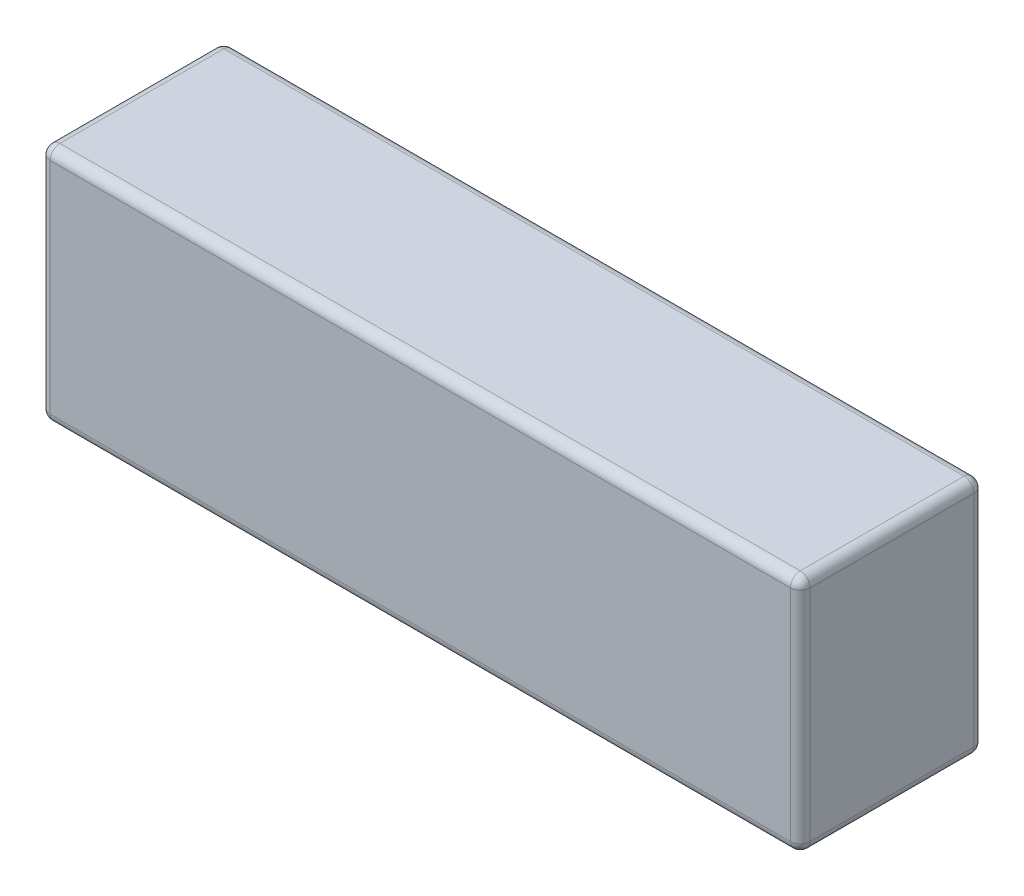
ISO-10303-21;
HEADER;
FILE_DESCRIPTION(('STEP AP214'),'2;1');
FILE_NAME('part.step','',(''),(''),'','','');
FILE_SCHEMA(('AUTOMOTIVE_DESIGN { 1 0 10303 214 1 1 1 1 }'));
ENDSEC;
DATA;
#1=APPLICATION_CONTEXT('core data for automotive mechanical design processes');
#2=APPLICATION_PROTOCOL_DEFINITION('international standard','automotive_design',2000,#1);
#3=PRODUCT_CONTEXT('',#1,'mechanical');
#4=PRODUCT('Part','Part','',(#3));
#5=PRODUCT_RELATED_PRODUCT_CATEGORY('part','',(#4));
#6=PRODUCT_DEFINITION_FORMATION('','',#4);
#7=PRODUCT_DEFINITION_CONTEXT('part definition',#1,'design');
#8=PRODUCT_DEFINITION('design','',#6,#7);
#9=PRODUCT_DEFINITION_SHAPE('','',#8);
#10=(LENGTH_UNIT() NAMED_UNIT(*) SI_UNIT(.MILLI.,.METRE.));
#11=(NAMED_UNIT(*) PLANE_ANGLE_UNIT() SI_UNIT($,.RADIAN.));
#12=(NAMED_UNIT(*) SI_UNIT($,.STERADIAN.) SOLID_ANGLE_UNIT());
#13=UNCERTAINTY_MEASURE_WITH_UNIT(LENGTH_MEASURE(1.E-05),#10,'distance_accuracy_value','');
#14=(GEOMETRIC_REPRESENTATION_CONTEXT(3) GLOBAL_UNCERTAINTY_ASSIGNED_CONTEXT((#13)) GLOBAL_UNIT_ASSIGNED_CONTEXT((#10,
#11,#12)) REPRESENTATION_CONTEXT('',''));
#15=CARTESIAN_POINT('',(0.,0.,0.));
#16=DIRECTION('',(0.,0.,1.));
#17=DIRECTION('',(1.,0.,0.));
#18=AXIS2_PLACEMENT_3D('',#15,#16,#17);
#19=CARTESIAN_POINT('',(-77.,48.5,18.6));
#20=DIRECTION('',(1.,0.,0.));
#21=DIRECTION('',(0.,0.,-1.));
#22=AXIS2_PLACEMENT_3D('',#19,#20,#21);
#23=PLANE('',#22);
#24=DIRECTION('',(0.,-1.,0.));
#25=VECTOR('',#24,1.);
#26=CARTESIAN_POINT('',(-77.,48.5,-16.6));
#27=LINE('',#26,#25);
#28=CARTESIAN_POINT('',(-77.,46.5,-16.6));
#29=VERTEX_POINT('',#28);
#30=CARTESIAN_POINT('',(-77.,2.,-16.6));
#31=VERTEX_POINT('',#30);
#32=EDGE_CURVE('E196',#29,#31,#27,.T.);
#33=ORIENTED_EDGE('',*,*,#32,.T.);
#34=DIRECTION('',(0.,0.,1.));
#35=VECTOR('',#34,1.);
#36=CARTESIAN_POINT('',(-77.,2.,18.6));
#37=LINE('',#36,#35);
#38=CARTESIAN_POINT('',(-77.,2.,16.6));
#39=VERTEX_POINT('',#38);
#40=EDGE_CURVE('E199',#31,#39,#37,.T.);
#41=ORIENTED_EDGE('',*,*,#40,.T.);
#42=DIRECTION('',(0.,-1.,0.));
#43=VECTOR('',#42,1.);
#44=CARTESIAN_POINT('',(-77.,48.5,16.6));
#45=LINE('',#44,#43);
#46=CARTESIAN_POINT('',(-77.,46.5,16.6));
#47=VERTEX_POINT('',#46);
#48=EDGE_CURVE('E190',#39,#47,#45,.F.);
#49=ORIENTED_EDGE('',*,*,#48,.T.);
#50=DIRECTION('',(0.,0.,1.));
#51=VECTOR('',#50,1.);
#52=CARTESIAN_POINT('',(-77.,46.5,-18.6));
#53=LINE('',#52,#51);
#54=EDGE_CURVE('E193',#47,#29,#53,.F.);
#55=ORIENTED_EDGE('',*,*,#54,.T.);
#56=EDGE_LOOP('',(#33,#41,#49,#55));
#57=FACE_BOUND('',#56,.T.);
#58=ADVANCED_FACE('F39',(#57),#23,.F.);
#59=CARTESIAN_POINT('',(77.,48.5,18.6));
#60=DIRECTION('',(0.,0.,-1.));
#61=DIRECTION('',(-1.,0.,0.));
#62=AXIS2_PLACEMENT_3D('',#59,#60,#61);
#63=PLANE('',#62);
#64=DIRECTION('',(1.,0.,0.));
#65=VECTOR('',#64,1.);
#66=CARTESIAN_POINT('',(-77.,46.5,18.6));
#67=LINE('',#66,#65);
#68=CARTESIAN_POINT('',(75.,46.5,18.6));
#69=VERTEX_POINT('',#68);
#70=CARTESIAN_POINT('',(-75.,46.5,18.6));
#71=VERTEX_POINT('',#70);
#72=EDGE_CURVE('E49',#69,#71,#67,.F.);
#73=ORIENTED_EDGE('',*,*,#72,.T.);
#74=DIRECTION('',(0.,-1.,0.));
#75=VECTOR('',#74,1.);
#76=CARTESIAN_POINT('',(-75.,48.5,18.6));
#77=LINE('',#76,#75);
#78=CARTESIAN_POINT('',(-75.,2.,18.6));
#79=VERTEX_POINT('',#78);
#80=EDGE_CURVE('E11',#71,#79,#77,.T.);
#81=ORIENTED_EDGE('',*,*,#80,.T.);
#82=DIRECTION('',(1.,0.,0.));
#83=VECTOR('',#82,1.);
#84=CARTESIAN_POINT('',(77.,2.,18.6));
#85=LINE('',#84,#83);
#86=CARTESIAN_POINT('',(75.,2.,18.6));
#87=VERTEX_POINT('',#86);
#88=EDGE_CURVE('E228',#79,#87,#85,.T.);
#89=ORIENTED_EDGE('',*,*,#88,.T.);
#90=DIRECTION('',(0.,-1.,0.));
#91=VECTOR('',#90,1.);
#92=CARTESIAN_POINT('',(75.,48.5,18.6));
#93=LINE('',#92,#91);
#94=EDGE_CURVE('E60',#87,#69,#93,.F.);
#95=ORIENTED_EDGE('',*,*,#94,.T.);
#96=EDGE_LOOP('',(#73,#81,#89,#95));
#97=FACE_BOUND('',#96,.T.);
#98=ADVANCED_FACE('F364',(#97),#63,.F.);
#99=CARTESIAN_POINT('',(77.,48.5,18.6));
#100=DIRECTION('',(-1.,0.,0.));
#101=DIRECTION('',(0.,0.,1.));
#102=AXIS2_PLACEMENT_3D('',#99,#100,#101);
#103=PLANE('',#102);
#104=DIRECTION('',(0.,-1.,0.));
#105=VECTOR('',#104,1.);
#106=CARTESIAN_POINT('',(77.,48.5,16.6));
#107=LINE('',#106,#105);
#108=CARTESIAN_POINT('',(77.,46.5,16.6));
#109=VERTEX_POINT('',#108);
#110=CARTESIAN_POINT('',(77.,2.,16.6));
#111=VERTEX_POINT('',#110);
#112=EDGE_CURVE('E132',#109,#111,#107,.T.);
#113=ORIENTED_EDGE('',*,*,#112,.T.);
#114=DIRECTION('',(0.,0.,-1.));
#115=VECTOR('',#114,1.);
#116=CARTESIAN_POINT('',(77.,2.,18.6));
#117=LINE('',#116,#115);
#118=CARTESIAN_POINT('',(77.,2.,-16.6));
#119=VERTEX_POINT('',#118);
#120=EDGE_CURVE('E174',#111,#119,#117,.T.);
#121=ORIENTED_EDGE('',*,*,#120,.T.);
#122=DIRECTION('',(0.,-1.,0.));
#123=VECTOR('',#122,1.);
#124=CARTESIAN_POINT('',(77.,48.5,-16.6));
#125=LINE('',#124,#123);
#126=CARTESIAN_POINT('',(77.,46.5,-16.6));
#127=VERTEX_POINT('',#126);
#128=EDGE_CURVE('E135',#119,#127,#125,.F.);
#129=ORIENTED_EDGE('',*,*,#128,.T.);
#130=DIRECTION('',(0.,0.,-1.));
#131=VECTOR('',#130,1.);
#132=CARTESIAN_POINT('',(77.,46.5,18.6));
#133=LINE('',#132,#131);
#134=EDGE_CURVE('E127',#127,#109,#133,.F.);
#135=ORIENTED_EDGE('',*,*,#134,.T.);
#136=EDGE_LOOP('',(#113,#121,#129,#135));
#137=FACE_BOUND('',#136,.T.);
#138=ADVANCED_FACE('F129',(#137),#103,.F.);
#139=CARTESIAN_POINT('',(77.,48.5,-18.6));
#140=DIRECTION('',(0.,0.,1.));
#141=DIRECTION('',(1.,0.,0.));
#142=AXIS2_PLACEMENT_3D('',#139,#140,#141);
#143=PLANE('',#142);
#144=DIRECTION('',(0.,-1.,0.));
#145=VECTOR('',#144,1.);
#146=CARTESIAN_POINT('',(75.,48.5,-18.6));
#147=LINE('',#146,#145);
#148=CARTESIAN_POINT('',(75.,46.5,-18.6));
#149=VERTEX_POINT('',#148);
#150=CARTESIAN_POINT('',(75.,2.,-18.6));
#151=VERTEX_POINT('',#150);
#152=EDGE_CURVE('E209',#149,#151,#147,.T.);
#153=ORIENTED_EDGE('',*,*,#152,.T.);
#154=DIRECTION('',(-1.,0.,0.));
#155=VECTOR('',#154,1.);
#156=CARTESIAN_POINT('',(77.,2.,-18.6));
#157=LINE('',#156,#155);
#158=CARTESIAN_POINT('',(-75.,2.,-18.6));
#159=VERTEX_POINT('',#158);
#160=EDGE_CURVE('E213',#151,#159,#157,.T.);
#161=ORIENTED_EDGE('',*,*,#160,.T.);
#162=DIRECTION('',(0.,-1.,0.));
#163=VECTOR('',#162,1.);
#164=CARTESIAN_POINT('',(-75.,48.5,-18.6));
#165=LINE('',#164,#163);
#166=CARTESIAN_POINT('',(-75.,46.5,-18.6));
#167=VERTEX_POINT('',#166);
#168=EDGE_CURVE('E206',#159,#167,#165,.F.);
#169=ORIENTED_EDGE('',*,*,#168,.T.);
#170=DIRECTION('',(-1.,0.,0.));
#171=VECTOR('',#170,1.);
#172=CARTESIAN_POINT('',(77.,46.5,-18.6));
#173=LINE('',#172,#171);
#174=EDGE_CURVE('E203',#167,#149,#173,.F.);
#175=ORIENTED_EDGE('',*,*,#174,.T.);
#176=EDGE_LOOP('',(#153,#161,#169,#175));
#177=FACE_BOUND('',#176,.T.);
#178=ADVANCED_FACE('F329',(#177),#143,.F.);
#179=CARTESIAN_POINT('',(0.,48.5,0.));
#180=DIRECTION('',(0.,1.,0.));
#181=DIRECTION('',(0.,0.,1.));
#182=AXIS2_PLACEMENT_3D('',#179,#180,#181);
#183=PLANE('',#182);
#184=DIRECTION('',(0.,0.,-1.));
#185=VECTOR('',#184,1.);
#186=CARTESIAN_POINT('',(75.,48.5,-18.6));
#187=LINE('',#186,#185);
#188=CARTESIAN_POINT('',(75.,48.5,16.6));
#189=VERTEX_POINT('',#188);
#190=CARTESIAN_POINT('',(75.,48.5,-16.6));
#191=VERTEX_POINT('',#190);
#192=EDGE_CURVE('E146',#189,#191,#187,.T.);
#193=ORIENTED_EDGE('',*,*,#192,.T.);
#194=DIRECTION('',(-1.,0.,0.));
#195=VECTOR('',#194,1.);
#196=CARTESIAN_POINT('',(-77.,48.5,-16.6));
#197=LINE('',#196,#195);
#198=CARTESIAN_POINT('',(-75.,48.5,-16.6));
#199=VERTEX_POINT('',#198);
#200=EDGE_CURVE('E224',#191,#199,#197,.T.);
#201=ORIENTED_EDGE('',*,*,#200,.T.);
#202=DIRECTION('',(0.,0.,1.));
#203=VECTOR('',#202,1.);
#204=CARTESIAN_POINT('',(-75.,48.5,18.6));
#205=LINE('',#204,#203);
#206=CARTESIAN_POINT('',(-75.,48.5,16.6));
#207=VERTEX_POINT('',#206);
#208=EDGE_CURVE('E219',#199,#207,#205,.T.);
#209=ORIENTED_EDGE('',*,*,#208,.T.);
#210=DIRECTION('',(1.,0.,0.));
#211=VECTOR('',#210,1.);
#212=CARTESIAN_POINT('',(77.,48.5,16.6));
#213=LINE('',#212,#211);
#214=EDGE_CURVE('E216',#207,#189,#213,.T.);
#215=ORIENTED_EDGE('',*,*,#214,.T.);
#216=EDGE_LOOP('',(#193,#201,#209,#215));
#217=FACE_BOUND('',#216,.T.);
#218=ADVANCED_FACE('F316',(#217),#183,.T.);
#219=CARTESIAN_POINT('',(0.,0.,0.));
#220=DIRECTION('',(0.,1.,0.));
#221=DIRECTION('',(0.,0.,1.));
#222=AXIS2_PLACEMENT_3D('',#219,#220,#221);
#223=PLANE('',#222);
#224=DIRECTION('',(0.,0.,1.));
#225=VECTOR('',#224,1.);
#226=CARTESIAN_POINT('',(-75.,0.,0.));
#227=LINE('',#226,#225);
#228=CARTESIAN_POINT('',(-75.,0.,16.6));
#229=VERTEX_POINT('',#228);
#230=CARTESIAN_POINT('',(-75.,0.,-16.6));
#231=VERTEX_POINT('',#230);
#232=EDGE_CURVE('E180',#229,#231,#227,.F.);
#233=ORIENTED_EDGE('',*,*,#232,.T.);
#234=DIRECTION('',(-1.,0.,0.));
#235=VECTOR('',#234,1.);
#236=CARTESIAN_POINT('',(0.,0.,-16.6));
#237=LINE('',#236,#235);
#238=CARTESIAN_POINT('',(75.,0.,-16.6));
#239=VERTEX_POINT('',#238);
#240=EDGE_CURVE('E187',#231,#239,#237,.F.);
#241=ORIENTED_EDGE('',*,*,#240,.T.);
#242=DIRECTION('',(0.,0.,-1.));
#243=VECTOR('',#242,1.);
#244=CARTESIAN_POINT('',(75.,0.,0.));
#245=LINE('',#244,#243);
#246=CARTESIAN_POINT('',(75.,0.,16.6));
#247=VERTEX_POINT('',#246);
#248=EDGE_CURVE('E183',#239,#247,#245,.F.);
#249=ORIENTED_EDGE('',*,*,#248,.T.);
#250=DIRECTION('',(1.,0.,0.));
#251=VECTOR('',#250,1.);
#252=CARTESIAN_POINT('',(0.,0.,16.6));
#253=LINE('',#252,#251);
#254=EDGE_CURVE('E177',#247,#229,#253,.F.);
#255=ORIENTED_EDGE('',*,*,#254,.T.);
#256=EDGE_LOOP('',(#233,#241,#249,#255));
#257=FACE_BOUND('',#256,.T.);
#258=ADVANCED_FACE('F530',(#257),#223,.F.);
#259=CARTESIAN_POINT('',(-75.,46.5,0.));
#260=DIRECTION('',(0.,0.,-1.));
#261=DIRECTION('',(-1.,0.,0.));
#262=AXIS2_PLACEMENT_3D('',#259,#260,#261);
#263=CYLINDRICAL_SURFACE('',#262,2.);
#264=CARTESIAN_POINT('',(-75.,46.5,16.6));
#265=DIRECTION('',(0.,0.,1.));
#266=DIRECTION('',(1.,0.,0.));
#267=AXIS2_PLACEMENT_3D('',#264,#265,#266);
#268=CIRCLE('',#267,2.);
#269=EDGE_CURVE('E43',#207,#47,#268,.T.);
#270=ORIENTED_EDGE('',*,*,#269,.F.);
#271=ORIENTED_EDGE('',*,*,#208,.F.);
#272=CARTESIAN_POINT('',(-75.,46.5,-16.6));
#273=DIRECTION('',(0.,0.,-1.));
#274=DIRECTION('',(0.,1.,0.));
#275=AXIS2_PLACEMENT_3D('',#272,#273,#274);
#276=CIRCLE('',#275,2.);
#277=EDGE_CURVE('E170',#29,#199,#276,.T.);
#278=ORIENTED_EDGE('',*,*,#277,.F.);
#279=ORIENTED_EDGE('',*,*,#54,.F.);
#280=EDGE_LOOP('',(#270,#271,#278,#279));
#281=FACE_BOUND('',#280,.T.);
#282=ADVANCED_FACE('F41',(#281),#263,.T.);
#283=CARTESIAN_POINT('',(-75.,46.5,16.6));
#284=DIRECTION('',(-1.,0.,0.));
#285=DIRECTION('',(0.,0.,1.));
#286=AXIS2_PLACEMENT_3D('',#283,#284,#285);
#287=SPHERICAL_SURFACE('',#286,2.);
#288=CARTESIAN_POINT('',(-75.,46.5,16.6));
#289=DIRECTION('',(-1.,0.,0.));
#290=DIRECTION('',(0.,-1.,0.));
#291=AXIS2_PLACEMENT_3D('',#288,#289,#290);
#292=CIRCLE('',#291,2.);
#293=EDGE_CURVE('E294',#207,#71,#292,.F.);
#294=ORIENTED_EDGE('',*,*,#293,.F.);
#295=ORIENTED_EDGE('',*,*,#269,.T.);
#296=CARTESIAN_POINT('',(-75.,46.5,16.6));
#297=DIRECTION('',(0.,1.,0.));
#298=DIRECTION('',(0.,0.,1.));
#299=AXIS2_PLACEMENT_3D('',#296,#297,#298);
#300=CIRCLE('',#299,2.);
#301=EDGE_CURVE('E297',#71,#47,#300,.F.);
#302=ORIENTED_EDGE('',*,*,#301,.F.);
#303=EDGE_LOOP('',(#294,#295,#302));
#304=FACE_BOUND('',#303,.T.);
#305=ADVANCED_FACE('F351',(#304),#287,.T.);
#306=CARTESIAN_POINT('',(-75.,46.5,-16.6));
#307=DIRECTION('',(0.,1.,0.));
#308=DIRECTION('',(0.,0.,1.));
#309=AXIS2_PLACEMENT_3D('',#306,#307,#308);
#310=SPHERICAL_SURFACE('',#309,2.);
#311=CARTESIAN_POINT('',(-75.,46.5,-16.6));
#312=DIRECTION('',(0.,1.,0.));
#313=DIRECTION('',(0.,0.,1.));
#314=AXIS2_PLACEMENT_3D('',#311,#312,#313);
#315=CIRCLE('',#314,2.);
#316=EDGE_CURVE('E287',#29,#167,#315,.F.);
#317=ORIENTED_EDGE('',*,*,#316,.F.);
#318=ORIENTED_EDGE('',*,*,#277,.T.);
#319=CARTESIAN_POINT('',(-75.,46.5,-16.6));
#320=DIRECTION('',(-1.,0.,0.));
#321=DIRECTION('',(0.,0.,1.));
#322=AXIS2_PLACEMENT_3D('',#319,#320,#321);
#323=CIRCLE('',#322,2.);
#324=EDGE_CURVE('E291',#167,#199,#323,.F.);
#325=ORIENTED_EDGE('',*,*,#324,.F.);
#326=EDGE_LOOP('',(#317,#318,#325));
#327=FACE_BOUND('',#326,.T.);
#328=ADVANCED_FACE('F307',(#327),#310,.T.);
#329=CARTESIAN_POINT('',(-75.,48.5,16.6));
#330=DIRECTION('',(0.,-1.,0.));
#331=DIRECTION('',(0.,0.,-1.));
#332=AXIS2_PLACEMENT_3D('',#329,#330,#331);
#333=CYLINDRICAL_SURFACE('',#332,2.);
#334=ORIENTED_EDGE('',*,*,#301,.T.);
#335=ORIENTED_EDGE('',*,*,#48,.F.);
#336=CARTESIAN_POINT('',(-75.,2.,16.6));
#337=DIRECTION('',(0.,-1.,0.));
#338=DIRECTION('',(0.,0.,-1.));
#339=AXIS2_PLACEMENT_3D('',#336,#337,#338);
#340=CIRCLE('',#339,2.);
#341=EDGE_CURVE('E280',#79,#39,#340,.T.);
#342=ORIENTED_EDGE('',*,*,#341,.F.);
#343=ORIENTED_EDGE('',*,*,#80,.F.);
#344=EDGE_LOOP('',(#334,#335,#342,#343));
#345=FACE_BOUND('',#344,.T.);
#346=ADVANCED_FACE('F347',(#345),#333,.T.);
#347=CARTESIAN_POINT('',(0.,46.5,16.6));
#348=DIRECTION('',(-1.,0.,0.));
#349=DIRECTION('',(0.,0.,1.));
#350=AXIS2_PLACEMENT_3D('',#347,#348,#349);
#351=CYLINDRICAL_SURFACE('',#350,2.);
#352=ORIENTED_EDGE('',*,*,#293,.T.);
#353=ORIENTED_EDGE('',*,*,#72,.F.);
#354=CARTESIAN_POINT('',(75.,46.5,16.6));
#355=DIRECTION('',(1.,0.,0.));
#356=DIRECTION('',(0.,0.,-1.));
#357=AXIS2_PLACEMENT_3D('',#354,#355,#356);
#358=CIRCLE('',#357,2.);
#359=EDGE_CURVE('E151',#189,#69,#358,.T.);
#360=ORIENTED_EDGE('',*,*,#359,.F.);
#361=ORIENTED_EDGE('',*,*,#214,.F.);
#362=EDGE_LOOP('',(#352,#353,#360,#361));
#363=FACE_BOUND('',#362,.T.);
#364=ADVANCED_FACE('F354',(#363),#351,.T.);
#365=CARTESIAN_POINT('',(75.,46.5,0.));
#366=DIRECTION('',(0.,0.,1.));
#367=DIRECTION('',(1.,0.,0.));
#368=AXIS2_PLACEMENT_3D('',#365,#366,#367);
#369=CYLINDRICAL_SURFACE('',#368,2.);
#370=CARTESIAN_POINT('',(75.,46.5,-16.6));
#371=DIRECTION('',(0.,0.,-1.));
#372=DIRECTION('',(-1.,0.,0.));
#373=AXIS2_PLACEMENT_3D('',#370,#371,#372);
#374=CIRCLE('',#373,2.);
#375=EDGE_CURVE('E152',#191,#127,#374,.T.);
#376=ORIENTED_EDGE('',*,*,#375,.F.);
#377=ORIENTED_EDGE('',*,*,#192,.F.);
#378=CARTESIAN_POINT('',(75.,46.5,16.6));
#379=DIRECTION('',(0.,0.,1.));
#380=DIRECTION('',(1.,0.,0.));
#381=AXIS2_PLACEMENT_3D('',#378,#379,#380);
#382=CIRCLE('',#381,2.);
#383=EDGE_CURVE('E143',#109,#189,#382,.T.);
#384=ORIENTED_EDGE('',*,*,#383,.F.);
#385=ORIENTED_EDGE('',*,*,#134,.F.);
#386=EDGE_LOOP('',(#376,#377,#384,#385));
#387=FACE_BOUND('',#386,.T.);
#388=ADVANCED_FACE('F145',(#387),#369,.T.);
#389=CARTESIAN_POINT('',(0.,46.5,-16.6));
#390=DIRECTION('',(1.,0.,0.));
#391=DIRECTION('',(0.,0.,-1.));
#392=AXIS2_PLACEMENT_3D('',#389,#390,#391);
#393=CYLINDRICAL_SURFACE('',#392,2.);
#394=ORIENTED_EDGE('',*,*,#324,.T.);
#395=ORIENTED_EDGE('',*,*,#200,.F.);
#396=CARTESIAN_POINT('',(75.,46.5,-16.6));
#397=DIRECTION('',(1.,0.,0.));
#398=DIRECTION('',(0.,0.,-1.));
#399=AXIS2_PLACEMENT_3D('',#396,#397,#398);
#400=CIRCLE('',#399,2.);
#401=EDGE_CURVE('E272',#149,#191,#400,.T.);
#402=ORIENTED_EDGE('',*,*,#401,.F.);
#403=ORIENTED_EDGE('',*,*,#174,.F.);
#404=EDGE_LOOP('',(#394,#395,#402,#403));
#405=FACE_BOUND('',#404,.T.);
#406=ADVANCED_FACE('F319',(#405),#393,.T.);
#407=CARTESIAN_POINT('',(-75.,48.5,-16.6));
#408=DIRECTION('',(0.,-1.,0.));
#409=DIRECTION('',(0.,0.,-1.));
#410=AXIS2_PLACEMENT_3D('',#407,#408,#409);
#411=CYLINDRICAL_SURFACE('',#410,2.);
#412=ORIENTED_EDGE('',*,*,#316,.T.);
#413=ORIENTED_EDGE('',*,*,#168,.F.);
#414=CARTESIAN_POINT('',(-75.,2.,-16.6));
#415=DIRECTION('',(0.,-1.,0.));
#416=DIRECTION('',(0.,0.,-1.));
#417=AXIS2_PLACEMENT_3D('',#414,#415,#416);
#418=CIRCLE('',#417,2.);
#419=EDGE_CURVE('E268',#31,#159,#418,.T.);
#420=ORIENTED_EDGE('',*,*,#419,.F.);
#421=ORIENTED_EDGE('',*,*,#32,.F.);
#422=EDGE_LOOP('',(#412,#413,#420,#421));
#423=FACE_BOUND('',#422,.T.);
#424=ADVANCED_FACE('F333',(#423),#411,.T.);
#425=CARTESIAN_POINT('',(-75.,2.,18.6));
#426=DIRECTION('',(0.,0.,1.));
#427=DIRECTION('',(1.,0.,0.));
#428=AXIS2_PLACEMENT_3D('',#425,#426,#427);
#429=CYLINDRICAL_SURFACE('',#428,2.);
#430=CARTESIAN_POINT('',(-75.,2.,16.6));
#431=DIRECTION('',(0.,0.,1.));
#432=DIRECTION('',(1.,0.,0.));
#433=AXIS2_PLACEMENT_3D('',#430,#431,#432);
#434=CIRCLE('',#433,2.);
#435=EDGE_CURVE('E283',#39,#229,#434,.T.);
#436=ORIENTED_EDGE('',*,*,#435,.F.);
#437=ORIENTED_EDGE('',*,*,#40,.F.);
#438=CARTESIAN_POINT('',(-75.,2.,-16.6));
#439=DIRECTION('',(0.,0.,-1.));
#440=DIRECTION('',(-1.,0.,0.));
#441=AXIS2_PLACEMENT_3D('',#438,#439,#440);
#442=CIRCLE('',#441,2.);
#443=EDGE_CURVE('E264',#231,#31,#442,.T.);
#444=ORIENTED_EDGE('',*,*,#443,.F.);
#445=ORIENTED_EDGE('',*,*,#232,.F.);
#446=EDGE_LOOP('',(#436,#437,#444,#445));
#447=FACE_BOUND('',#446,.T.);
#448=ADVANCED_FACE('F339',(#447),#429,.T.);
#449=CARTESIAN_POINT('',(-75.,2.,16.6));
#450=DIRECTION('',(-1.,0.,0.));
#451=DIRECTION('',(0.,-1.,0.));
#452=AXIS2_PLACEMENT_3D('',#449,#450,#451);
#453=SPHERICAL_SURFACE('',#452,2.);
#454=ORIENTED_EDGE('',*,*,#341,.T.);
#455=ORIENTED_EDGE('',*,*,#435,.T.);
#456=CARTESIAN_POINT('',(-75.,2.,16.6));
#457=DIRECTION('',(-1.,0.,0.));
#458=DIRECTION('',(0.,0.,1.));
#459=AXIS2_PLACEMENT_3D('',#456,#457,#458);
#460=CIRCLE('',#459,2.);
#461=EDGE_CURVE('E159',#79,#229,#460,.F.);
#462=ORIENTED_EDGE('',*,*,#461,.F.);
#463=EDGE_LOOP('',(#454,#455,#462));
#464=FACE_BOUND('',#463,.T.);
#465=ADVANCED_FACE('F404',(#464),#453,.T.);
#466=CARTESIAN_POINT('',(75.,46.5,16.6));
#467=DIRECTION('',(0.,1.,0.));
#468=DIRECTION('',(0.,0.,1.));
#469=AXIS2_PLACEMENT_3D('',#466,#467,#468);
#470=SPHERICAL_SURFACE('',#469,2.);
#471=ORIENTED_EDGE('',*,*,#383,.T.);
#472=ORIENTED_EDGE('',*,*,#359,.T.);
#473=CARTESIAN_POINT('',(75.,46.5,16.6));
#474=DIRECTION('',(0.,1.,0.));
#475=DIRECTION('',(0.,0.,1.));
#476=AXIS2_PLACEMENT_3D('',#473,#474,#475);
#477=CIRCLE('',#476,2.);
#478=EDGE_CURVE('E155',#109,#69,#477,.F.);
#479=ORIENTED_EDGE('',*,*,#478,.F.);
#480=EDGE_LOOP('',(#471,#472,#479));
#481=FACE_BOUND('',#480,.T.);
#482=ADVANCED_FACE('F156',(#481),#470,.T.);
#483=CARTESIAN_POINT('',(75.,46.5,-16.6));
#484=DIRECTION('',(0.,1.,0.));
#485=DIRECTION('',(0.,0.,1.));
#486=AXIS2_PLACEMENT_3D('',#483,#484,#485);
#487=SPHERICAL_SURFACE('',#486,2.);
#488=ORIENTED_EDGE('',*,*,#401,.T.);
#489=ORIENTED_EDGE('',*,*,#375,.T.);
#490=CARTESIAN_POINT('',(75.,46.5,-16.6));
#491=DIRECTION('',(0.,1.,0.));
#492=DIRECTION('',(0.,0.,1.));
#493=AXIS2_PLACEMENT_3D('',#490,#491,#492);
#494=CIRCLE('',#493,2.);
#495=EDGE_CURVE('E160',#149,#127,#494,.F.);
#496=ORIENTED_EDGE('',*,*,#495,.F.);
#497=EDGE_LOOP('',(#488,#489,#496));
#498=FACE_BOUND('',#497,.T.);
#499=ADVANCED_FACE('F322',(#498),#487,.T.);
#500=CARTESIAN_POINT('',(-75.,2.,-16.6));
#501=DIRECTION('',(-1.,0.,0.));
#502=DIRECTION('',(0.,0.,1.));
#503=AXIS2_PLACEMENT_3D('',#500,#501,#502);
#504=SPHERICAL_SURFACE('',#503,2.);
#505=ORIENTED_EDGE('',*,*,#443,.T.);
#506=ORIENTED_EDGE('',*,*,#419,.T.);
#507=CARTESIAN_POINT('',(-75.,2.,-16.6));
#508=DIRECTION('',(-1.,0.,0.));
#509=DIRECTION('',(0.,0.,1.));
#510=AXIS2_PLACEMENT_3D('',#507,#508,#509);
#511=CIRCLE('',#510,2.);
#512=EDGE_CURVE('E254',#231,#159,#511,.F.);
#513=ORIENTED_EDGE('',*,*,#512,.F.);
#514=EDGE_LOOP('',(#505,#506,#513));
#515=FACE_BOUND('',#514,.T.);
#516=ADVANCED_FACE('F395',(#515),#504,.T.);
#517=CARTESIAN_POINT('',(77.,2.,16.6));
#518=DIRECTION('',(1.,0.,0.));
#519=DIRECTION('',(0.,0.,-1.));
#520=AXIS2_PLACEMENT_3D('',#517,#518,#519);
#521=CYLINDRICAL_SURFACE('',#520,2.);
#522=ORIENTED_EDGE('',*,*,#461,.T.);
#523=ORIENTED_EDGE('',*,*,#254,.F.);
#524=CARTESIAN_POINT('',(75.,2.,16.6));
#525=DIRECTION('',(1.,0.,0.));
#526=DIRECTION('',(0.,0.,-1.));
#527=AXIS2_PLACEMENT_3D('',#524,#525,#526);
#528=CIRCLE('',#527,2.);
#529=EDGE_CURVE('E250',#87,#247,#528,.T.);
#530=ORIENTED_EDGE('',*,*,#529,.F.);
#531=ORIENTED_EDGE('',*,*,#88,.F.);
#532=EDGE_LOOP('',(#522,#523,#530,#531));
#533=FACE_BOUND('',#532,.T.);
#534=ADVANCED_FACE('F392',(#533),#521,.T.);
#535=CARTESIAN_POINT('',(75.,48.5,16.6));
#536=DIRECTION('',(0.,-1.,0.));
#537=DIRECTION('',(0.,0.,-1.));
#538=AXIS2_PLACEMENT_3D('',#535,#536,#537);
#539=CYLINDRICAL_SURFACE('',#538,2.);
#540=ORIENTED_EDGE('',*,*,#478,.T.);
#541=ORIENTED_EDGE('',*,*,#94,.F.);
#542=CARTESIAN_POINT('',(75.,2.,16.6));
#543=DIRECTION('',(0.,-1.,0.));
#544=DIRECTION('',(0.,0.,-1.));
#545=AXIS2_PLACEMENT_3D('',#542,#543,#544);
#546=CIRCLE('',#545,2.);
#547=EDGE_CURVE('E164',#111,#87,#546,.T.);
#548=ORIENTED_EDGE('',*,*,#547,.F.);
#549=ORIENTED_EDGE('',*,*,#112,.F.);
#550=EDGE_LOOP('',(#540,#541,#548,#549));
#551=FACE_BOUND('',#550,.T.);
#552=ADVANCED_FACE('F162',(#551),#539,.T.);
#553=CARTESIAN_POINT('',(75.,48.5,-16.6));
#554=DIRECTION('',(0.,-1.,0.));
#555=DIRECTION('',(0.,0.,-1.));
#556=AXIS2_PLACEMENT_3D('',#553,#554,#555);
#557=CYLINDRICAL_SURFACE('',#556,2.);
#558=ORIENTED_EDGE('',*,*,#495,.T.);
#559=ORIENTED_EDGE('',*,*,#128,.F.);
#560=CARTESIAN_POINT('',(75.,2.,-16.6));
#561=DIRECTION('',(0.,-1.,0.));
#562=DIRECTION('',(0.,0.,-1.));
#563=AXIS2_PLACEMENT_3D('',#560,#561,#562);
#564=CIRCLE('',#563,2.);
#565=EDGE_CURVE('E244',#151,#119,#564,.T.);
#566=ORIENTED_EDGE('',*,*,#565,.F.);
#567=ORIENTED_EDGE('',*,*,#152,.F.);
#568=EDGE_LOOP('',(#558,#559,#566,#567));
#569=FACE_BOUND('',#568,.T.);
#570=ADVANCED_FACE('F326',(#569),#557,.T.);
#571=CARTESIAN_POINT('',(77.,2.,-16.6));
#572=DIRECTION('',(-1.,0.,0.));
#573=DIRECTION('',(0.,0.,1.));
#574=AXIS2_PLACEMENT_3D('',#571,#572,#573);
#575=CYLINDRICAL_SURFACE('',#574,2.);
#576=ORIENTED_EDGE('',*,*,#512,.T.);
#577=ORIENTED_EDGE('',*,*,#160,.F.);
#578=CARTESIAN_POINT('',(75.,2.,-16.6));
#579=DIRECTION('',(1.,0.,0.));
#580=DIRECTION('',(0.,0.,-1.));
#581=AXIS2_PLACEMENT_3D('',#578,#579,#580);
#582=CIRCLE('',#581,2.);
#583=EDGE_CURVE('E241',#239,#151,#582,.T.);
#584=ORIENTED_EDGE('',*,*,#583,.F.);
#585=ORIENTED_EDGE('',*,*,#240,.F.);
#586=EDGE_LOOP('',(#576,#577,#584,#585));
#587=FACE_BOUND('',#586,.T.);
#588=ADVANCED_FACE('F383',(#587),#575,.T.);
#589=CARTESIAN_POINT('',(75.,2.,16.6));
#590=DIRECTION('',(0.,0.,1.));
#591=DIRECTION('',(0.,-1.,0.));
#592=AXIS2_PLACEMENT_3D('',#589,#590,#591);
#593=SPHERICAL_SURFACE('',#592,2.);
#594=ORIENTED_EDGE('',*,*,#547,.T.);
#595=ORIENTED_EDGE('',*,*,#529,.T.);
#596=CARTESIAN_POINT('',(75.,2.,16.6));
#597=DIRECTION('',(0.,0.,1.));
#598=DIRECTION('',(1.,0.,0.));
#599=AXIS2_PLACEMENT_3D('',#596,#597,#598);
#600=CIRCLE('',#599,2.);
#601=EDGE_CURVE('E238',#111,#247,#600,.F.);
#602=ORIENTED_EDGE('',*,*,#601,.F.);
#603=EDGE_LOOP('',(#594,#595,#602));
#604=FACE_BOUND('',#603,.T.);
#605=ADVANCED_FACE('F379',(#604),#593,.T.);
#606=CARTESIAN_POINT('',(75.,2.,-16.6));
#607=DIRECTION('',(0.,0.,-1.));
#608=DIRECTION('',(0.,1.,0.));
#609=AXIS2_PLACEMENT_3D('',#606,#607,#608);
#610=SPHERICAL_SURFACE('',#609,2.);
#611=ORIENTED_EDGE('',*,*,#583,.T.);
#612=ORIENTED_EDGE('',*,*,#565,.T.);
#613=CARTESIAN_POINT('',(75.,2.,-16.6));
#614=DIRECTION('',(0.,0.,-1.));
#615=DIRECTION('',(-1.,0.,0.));
#616=AXIS2_PLACEMENT_3D('',#613,#614,#615);
#617=CIRCLE('',#616,2.);
#618=EDGE_CURVE('E235',#239,#119,#617,.F.);
#619=ORIENTED_EDGE('',*,*,#618,.F.);
#620=EDGE_LOOP('',(#611,#612,#619));
#621=FACE_BOUND('',#620,.T.);
#622=ADVANCED_FACE('F375',(#621),#610,.T.);
#623=CARTESIAN_POINT('',(75.,2.,18.6));
#624=DIRECTION('',(0.,0.,-1.));
#625=DIRECTION('',(-1.,0.,0.));
#626=AXIS2_PLACEMENT_3D('',#623,#624,#625);
#627=CYLINDRICAL_SURFACE('',#626,2.);
#628=ORIENTED_EDGE('',*,*,#601,.T.);
#629=ORIENTED_EDGE('',*,*,#248,.F.);
#630=ORIENTED_EDGE('',*,*,#618,.T.);
#631=ORIENTED_EDGE('',*,*,#120,.F.);
#632=EDGE_LOOP('',(#628,#629,#630,#631));
#633=FACE_BOUND('',#632,.T.);
#634=ADVANCED_FACE('F372',(#633),#627,.T.);
#635=CLOSED_SHELL('',(#58,#98,#138,#178,#218,#258,#282,#305,#328,#346,#364,#388,#406,#424,#448,
#465,#482,#499,#516,#534,#552,#570,#588,#605,#622,#634));
#636=MANIFOLD_SOLID_BREP('B2',#635);
#637=ADVANCED_BREP_SHAPE_REPRESENTATION('',(#18,#636),#14);
#638=SHAPE_DEFINITION_REPRESENTATION(#9,#637);
ENDSEC;
END-ISO-10303-21;
